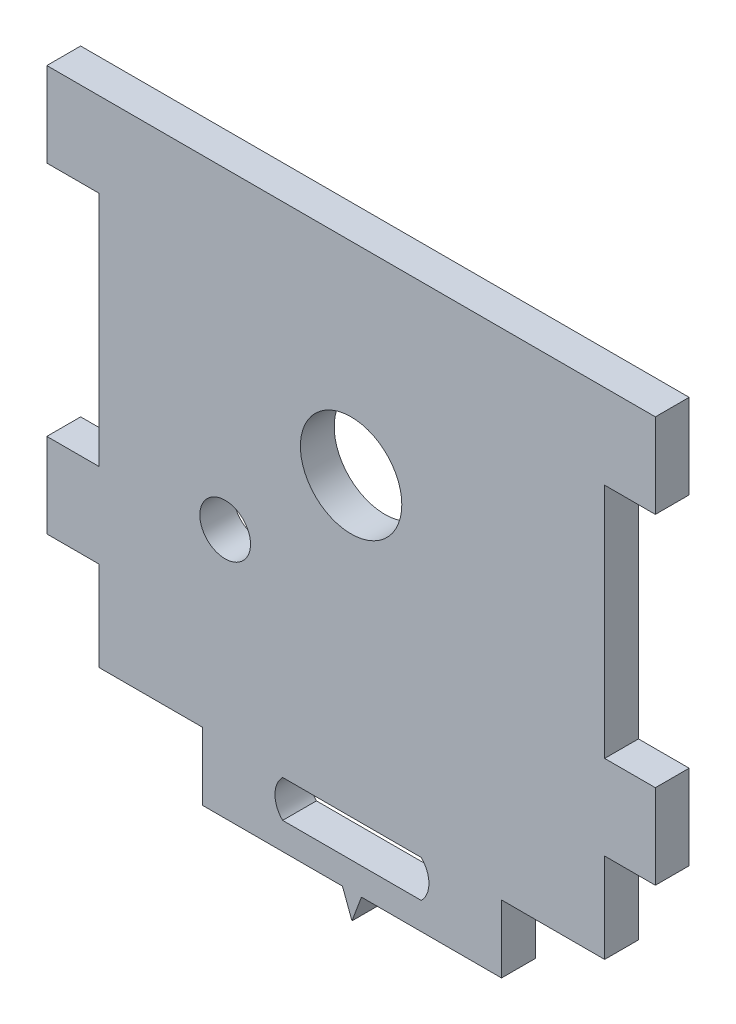
ISO-10303-21;
HEADER;
FILE_DESCRIPTION(('STEP AP214'),'2;1');
FILE_NAME('part.step','',(''),(''),'','','');
FILE_SCHEMA(('AUTOMOTIVE_DESIGN { 1 0 10303 214 1 1 1 1 }'));
ENDSEC;
DATA;
#1=APPLICATION_CONTEXT('core data for automotive mechanical design processes');
#2=APPLICATION_PROTOCOL_DEFINITION('international standard','automotive_design',2000,#1);
#3=PRODUCT_CONTEXT('',#1,'mechanical');
#4=PRODUCT('Part','Part','',(#3));
#5=PRODUCT_RELATED_PRODUCT_CATEGORY('part','',(#4));
#6=PRODUCT_DEFINITION_FORMATION('','',#4);
#7=PRODUCT_DEFINITION_CONTEXT('part definition',#1,'design');
#8=PRODUCT_DEFINITION('design','',#6,#7);
#9=PRODUCT_DEFINITION_SHAPE('','',#8);
#10=(LENGTH_UNIT() NAMED_UNIT(*) SI_UNIT(.MILLI.,.METRE.));
#11=(NAMED_UNIT(*) PLANE_ANGLE_UNIT() SI_UNIT($,.RADIAN.));
#12=(NAMED_UNIT(*) SI_UNIT($,.STERADIAN.) SOLID_ANGLE_UNIT());
#13=UNCERTAINTY_MEASURE_WITH_UNIT(LENGTH_MEASURE(1.E-05),#10,'distance_accuracy_value','');
#14=(GEOMETRIC_REPRESENTATION_CONTEXT(3) GLOBAL_UNCERTAINTY_ASSIGNED_CONTEXT((#13)) GLOBAL_UNIT_ASSIGNED_CONTEXT((#10,
#11,#12)) REPRESENTATION_CONTEXT('',''));
#15=CARTESIAN_POINT('',(0.,0.,0.));
#16=DIRECTION('',(0.,0.,1.));
#17=DIRECTION('',(1.,0.,0.));
#18=AXIS2_PLACEMENT_3D('',#15,#16,#17);
#19=CARTESIAN_POINT('',(0.,0.,2.));
#20=DIRECTION('',(0.,0.,1.));
#21=DIRECTION('',(1.,0.,0.));
#22=AXIS2_PLACEMENT_3D('',#19,#20,#21);
#23=PLANE('',#22);
#24=DIRECTION('',(-1.,0.,0.));
#25=VECTOR('',#24,1.);
#26=CARTESIAN_POINT('',(-22.05,-24.5,2.));
#27=LINE('',#26,#25);
#28=CARTESIAN_POINT('',(-13.85,-24.5,2.));
#29=VERTEX_POINT('',#28);
#30=CARTESIAN_POINT('',(-22.05,-24.5,2.));
#31=VERTEX_POINT('',#30);
#32=EDGE_CURVE('E220',#29,#31,#27,.T.);
#33=ORIENTED_EDGE('',*,*,#32,.F.);
#34=CARTESIAN_POINT('',(-14.95,-25.6,2.));
#35=DIRECTION('',(0.,0.,1.));
#36=DIRECTION('',(1.,0.,0.));
#37=AXIS2_PLACEMENT_3D('',#34,#35,#36);
#38=CIRCLE('',#37,1.55563491861041);
#39=CARTESIAN_POINT('',(-13.85,-26.7,2.));
#40=VERTEX_POINT('',#39);
#41=EDGE_CURVE('E212',#40,#29,#38,.T.);
#42=ORIENTED_EDGE('',*,*,#41,.F.);
#43=DIRECTION('',(1.,0.,0.));
#44=VECTOR('',#43,1.);
#45=CARTESIAN_POINT('',(-22.05,-26.7,2.));
#46=LINE('',#45,#44);
#47=CARTESIAN_POINT('',(-22.05,-26.7,2.));
#48=VERTEX_POINT('',#47);
#49=EDGE_CURVE('E235',#48,#40,#46,.T.);
#50=ORIENTED_EDGE('',*,*,#49,.F.);
#51=CARTESIAN_POINT('',(-20.95,-25.6,2.));
#52=DIRECTION('',(0.,0.,1.));
#53=DIRECTION('',(-1.,0.,0.));
#54=AXIS2_PLACEMENT_3D('',#51,#52,#53);
#55=CIRCLE('',#54,1.55563491861041);
#56=EDGE_CURVE('E233',#31,#48,#55,.T.);
#57=ORIENTED_EDGE('',*,*,#56,.F.);
#58=EDGE_LOOP('',(#33,#42,#50,#57));
#59=FACE_BOUND('',#58,.T.);
#60=CARTESIAN_POINT('',(-18.,-7.,2.));
#61=DIRECTION('',(0.,0.,1.));
#62=DIRECTION('',(1.,0.,0.));
#63=AXIS2_PLACEMENT_3D('',#60,#61,#62);
#64=CIRCLE('',#63,3.);
#65=CARTESIAN_POINT('',(-15.,-7.,2.));
#66=VERTEX_POINT('',#65);
#67=EDGE_CURVE('E251',#66,#66,#64,.T.);
#68=ORIENTED_EDGE('',*,*,#67,.F.);
#69=EDGE_LOOP('',(#68));
#70=FACE_BOUND('',#69,.T.);
#71=DIRECTION('',(1.,0.,0.));
#72=VECTOR('',#71,1.);
#73=CARTESIAN_POINT('',(0.,0.,2.));
#74=LINE('',#73,#72);
#75=CARTESIAN_POINT('',(-3.,0.,2.));
#76=VERTEX_POINT('',#75);
#77=CARTESIAN_POINT('',(0.,0.,2.));
#78=VERTEX_POINT('',#77);
#79=EDGE_CURVE('E257',#76,#78,#74,.T.);
#80=ORIENTED_EDGE('',*,*,#79,.T.);
#81=DIRECTION('',(0.,1.,0.));
#82=VECTOR('',#81,1.);
#83=CARTESIAN_POINT('',(0.,0.,2.));
#84=LINE('',#83,#82);
#85=CARTESIAN_POINT('',(0.,5.,2.));
#86=VERTEX_POINT('',#85);
#87=EDGE_CURVE('E260',#78,#86,#84,.T.);
#88=ORIENTED_EDGE('',*,*,#87,.T.);
#89=DIRECTION('',(-1.,0.,0.));
#90=VECTOR('',#89,1.);
#91=CARTESIAN_POINT('',(0.,5.,2.));
#92=LINE('',#91,#90);
#93=CARTESIAN_POINT('',(-36.,5.,2.));
#94=VERTEX_POINT('',#93);
#95=EDGE_CURVE('E263',#86,#94,#92,.T.);
#96=ORIENTED_EDGE('',*,*,#95,.T.);
#97=DIRECTION('',(0.,-1.,0.));
#98=VECTOR('',#97,1.);
#99=CARTESIAN_POINT('',(-36.,0.,2.));
#100=LINE('',#99,#98);
#101=CARTESIAN_POINT('',(-36.,0.,2.));
#102=VERTEX_POINT('',#101);
#103=EDGE_CURVE('E265',#94,#102,#100,.T.);
#104=ORIENTED_EDGE('',*,*,#103,.T.);
#105=DIRECTION('',(1.,0.,0.));
#106=VECTOR('',#105,1.);
#107=CARTESIAN_POINT('',(-36.,0.,2.));
#108=LINE('',#107,#106);
#109=CARTESIAN_POINT('',(-32.9,0.,2.));
#110=VERTEX_POINT('',#109);
#111=EDGE_CURVE('E267',#102,#110,#108,.T.);
#112=ORIENTED_EDGE('',*,*,#111,.T.);
#113=DIRECTION('',(0.,-1.,0.));
#114=VECTOR('',#113,1.);
#115=CARTESIAN_POINT('',(-32.9,0.,2.));
#116=LINE('',#115,#114);
#117=CARTESIAN_POINT('',(-32.9,-14.,2.));
#118=VERTEX_POINT('',#117);
#119=EDGE_CURVE('E269',#110,#118,#116,.T.);
#120=ORIENTED_EDGE('',*,*,#119,.T.);
#121=DIRECTION('',(-1.,0.,0.));
#122=VECTOR('',#121,1.);
#123=CARTESIAN_POINT('',(-32.9,-14.,2.));
#124=LINE('',#123,#122);
#125=CARTESIAN_POINT('',(-36.,-14.,2.));
#126=VERTEX_POINT('',#125);
#127=EDGE_CURVE('E271',#118,#126,#124,.T.);
#128=ORIENTED_EDGE('',*,*,#127,.T.);
#129=DIRECTION('',(0.,-1.,0.));
#130=VECTOR('',#129,1.);
#131=CARTESIAN_POINT('',(-36.,-14.,2.));
#132=LINE('',#131,#130);
#133=CARTESIAN_POINT('',(-36.,-19.,2.));
#134=VERTEX_POINT('',#133);
#135=EDGE_CURVE('E273',#126,#134,#132,.T.);
#136=ORIENTED_EDGE('',*,*,#135,.T.);
#137=DIRECTION('',(1.,0.,0.));
#138=VECTOR('',#137,1.);
#139=CARTESIAN_POINT('',(-36.,-19.,2.));
#140=LINE('',#139,#138);
#141=CARTESIAN_POINT('',(-32.9,-19.,2.));
#142=VERTEX_POINT('',#141);
#143=EDGE_CURVE('E275',#134,#142,#140,.T.);
#144=ORIENTED_EDGE('',*,*,#143,.T.);
#145=DIRECTION('',(0.,-1.,0.));
#146=VECTOR('',#145,1.);
#147=CARTESIAN_POINT('',(-32.9,-19.,2.));
#148=LINE('',#147,#146);
#149=CARTESIAN_POINT('',(-32.9,-24.3,2.));
#150=VERTEX_POINT('',#149);
#151=EDGE_CURVE('E277',#142,#150,#148,.T.);
#152=ORIENTED_EDGE('',*,*,#151,.T.);
#153=DIRECTION('',(1.,0.,0.));
#154=VECTOR('',#153,1.);
#155=CARTESIAN_POINT('',(-32.9,-24.3,2.));
#156=LINE('',#155,#154);
#157=CARTESIAN_POINT('',(-26.8,-24.3,2.));
#158=VERTEX_POINT('',#157);
#159=EDGE_CURVE('E279',#150,#158,#156,.T.);
#160=ORIENTED_EDGE('',*,*,#159,.T.);
#161=DIRECTION('',(0.,-1.,0.));
#162=VECTOR('',#161,1.);
#163=CARTESIAN_POINT('',(-26.8,-28.3,2.));
#164=LINE('',#163,#162);
#165=CARTESIAN_POINT('',(-26.8,-28.3,2.));
#166=VERTEX_POINT('',#165);
#167=EDGE_CURVE('E281',#158,#166,#164,.T.);
#168=ORIENTED_EDGE('',*,*,#167,.T.);
#169=DIRECTION('',(1.,0.,0.));
#170=VECTOR('',#169,1.);
#171=CARTESIAN_POINT('',(-18.511559339157,-28.3,2.));
#172=LINE('',#171,#170);
#173=CARTESIAN_POINT('',(-18.511559339157,-28.3,2.));
#174=VERTEX_POINT('',#173);
#175=EDGE_CURVE('E283',#166,#174,#172,.T.);
#176=ORIENTED_EDGE('',*,*,#175,.T.);
#177=DIRECTION('',(0.350608495530958,-0.936522120860751,0.));
#178=VECTOR('',#177,1.);
#179=CARTESIAN_POINT('',(-17.95,-29.8,2.));
#180=LINE('',#179,#178);
#181=CARTESIAN_POINT('',(-17.95,-29.8,2.));
#182=VERTEX_POINT('',#181);
#183=EDGE_CURVE('E285',#174,#182,#180,.T.);
#184=ORIENTED_EDGE('',*,*,#183,.T.);
#185=DIRECTION('',(0.350608495530958,0.936522120860751,0.));
#186=VECTOR('',#185,1.);
#187=CARTESIAN_POINT('',(-17.95,-29.8,2.));
#188=LINE('',#187,#186);
#189=CARTESIAN_POINT('',(-17.388440660843,-28.3,2.));
#190=VERTEX_POINT('',#189);
#191=EDGE_CURVE('E287',#182,#190,#188,.T.);
#192=ORIENTED_EDGE('',*,*,#191,.T.);
#193=DIRECTION('',(1.,0.,0.));
#194=VECTOR('',#193,1.);
#195=CARTESIAN_POINT('',(-17.388440660843,-28.3,2.));
#196=LINE('',#195,#194);
#197=CARTESIAN_POINT('',(-9.1,-28.3,2.));
#198=VERTEX_POINT('',#197);
#199=EDGE_CURVE('E289',#190,#198,#196,.T.);
#200=ORIENTED_EDGE('',*,*,#199,.T.);
#201=DIRECTION('',(0.,1.,0.));
#202=VECTOR('',#201,1.);
#203=CARTESIAN_POINT('',(-9.1,-24.3,2.));
#204=LINE('',#203,#202);
#205=CARTESIAN_POINT('',(-9.1,-24.3,2.));
#206=VERTEX_POINT('',#205);
#207=EDGE_CURVE('E291',#198,#206,#204,.T.);
#208=ORIENTED_EDGE('',*,*,#207,.T.);
#209=DIRECTION('',(1.,0.,0.));
#210=VECTOR('',#209,1.);
#211=CARTESIAN_POINT('',(-3.,-24.3,2.));
#212=LINE('',#211,#210);
#213=CARTESIAN_POINT('',(-3.,-24.3,2.));
#214=VERTEX_POINT('',#213);
#215=EDGE_CURVE('E293',#206,#214,#212,.T.);
#216=ORIENTED_EDGE('',*,*,#215,.T.);
#217=DIRECTION('',(0.,1.,0.));
#218=VECTOR('',#217,1.);
#219=CARTESIAN_POINT('',(-3.,-19.,2.));
#220=LINE('',#219,#218);
#221=CARTESIAN_POINT('',(-3.,-19.,2.));
#222=VERTEX_POINT('',#221);
#223=EDGE_CURVE('E295',#214,#222,#220,.T.);
#224=ORIENTED_EDGE('',*,*,#223,.T.);
#225=DIRECTION('',(1.,0.,0.));
#226=VECTOR('',#225,1.);
#227=CARTESIAN_POINT('',(0.,-19.,2.));
#228=LINE('',#227,#226);
#229=CARTESIAN_POINT('',(0.,-19.,2.));
#230=VERTEX_POINT('',#229);
#231=EDGE_CURVE('E297',#222,#230,#228,.T.);
#232=ORIENTED_EDGE('',*,*,#231,.T.);
#233=DIRECTION('',(0.,1.,0.));
#234=VECTOR('',#233,1.);
#235=CARTESIAN_POINT('',(0.,-14.,2.));
#236=LINE('',#235,#234);
#237=CARTESIAN_POINT('',(0.,-14.,2.));
#238=VERTEX_POINT('',#237);
#239=EDGE_CURVE('E299',#230,#238,#236,.T.);
#240=ORIENTED_EDGE('',*,*,#239,.T.);
#241=DIRECTION('',(-1.,0.,0.));
#242=VECTOR('',#241,1.);
#243=CARTESIAN_POINT('',(-3.,-14.,2.));
#244=LINE('',#243,#242);
#245=CARTESIAN_POINT('',(-3.,-14.,2.));
#246=VERTEX_POINT('',#245);
#247=EDGE_CURVE('E301',#238,#246,#244,.T.);
#248=ORIENTED_EDGE('',*,*,#247,.T.);
#249=DIRECTION('',(0.,1.,0.));
#250=VECTOR('',#249,1.);
#251=CARTESIAN_POINT('',(-3.,0.,2.));
#252=LINE('',#251,#250);
#253=EDGE_CURVE('E303',#246,#76,#252,.T.);
#254=ORIENTED_EDGE('',*,*,#253,.T.);
#255=EDGE_LOOP('',(#80,#88,#96,#104,#112,#120,#128,#136,#144,#152,#160,#168,#176,#184,#192,#200,
#208,#216,#224,#232,#240,#248,#254));
#256=FACE_BOUND('',#255,.T.);
#257=CARTESIAN_POINT('',(-25.45,-13.5,2.));
#258=DIRECTION('',(0.,0.,1.));
#259=DIRECTION('',(1.,0.,0.));
#260=AXIS2_PLACEMENT_3D('',#257,#258,#259);
#261=CIRCLE('',#260,1.5);
#262=CARTESIAN_POINT('',(-23.95,-13.5,2.));
#263=VERTEX_POINT('',#262);
#264=EDGE_CURVE('E241',#263,#263,#261,.T.);
#265=ORIENTED_EDGE('',*,*,#264,.F.);
#266=EDGE_LOOP('',(#265));
#267=FACE_BOUND('',#266,.T.);
#268=ADVANCED_FACE('F33',(#59,#70,#256,#267),#23,.T.);
#269=CARTESIAN_POINT('',(0.,0.,0.));
#270=DIRECTION('',(0.,0.,1.));
#271=DIRECTION('',(1.,0.,0.));
#272=AXIS2_PLACEMENT_3D('',#269,#270,#271);
#273=PLANE('',#272);
#274=CARTESIAN_POINT('',(-18.,-7.,0.));
#275=DIRECTION('',(0.,0.,1.));
#276=DIRECTION('',(1.,0.,0.));
#277=AXIS2_PLACEMENT_3D('',#274,#275,#276);
#278=CIRCLE('',#277,3.);
#279=CARTESIAN_POINT('',(-15.,-7.,0.));
#280=VERTEX_POINT('',#279);
#281=EDGE_CURVE('E228',#280,#280,#278,.T.);
#282=ORIENTED_EDGE('',*,*,#281,.T.);
#283=EDGE_LOOP('',(#282));
#284=FACE_BOUND('',#283,.T.);
#285=DIRECTION('',(1.,0.,0.));
#286=VECTOR('',#285,1.);
#287=CARTESIAN_POINT('',(0.,0.,0.));
#288=LINE('',#287,#286);
#289=CARTESIAN_POINT('',(-3.,0.,0.));
#290=VERTEX_POINT('',#289);
#291=CARTESIAN_POINT('',(0.,0.,0.));
#292=VERTEX_POINT('',#291);
#293=EDGE_CURVE('E254',#290,#292,#288,.T.);
#294=ORIENTED_EDGE('',*,*,#293,.F.);
#295=DIRECTION('',(0.,1.,0.));
#296=VECTOR('',#295,1.);
#297=CARTESIAN_POINT('',(-3.,0.,0.));
#298=LINE('',#297,#296);
#299=CARTESIAN_POINT('',(-3.,-14.,0.));
#300=VERTEX_POINT('',#299);
#301=EDGE_CURVE('E261',#300,#290,#298,.T.);
#302=ORIENTED_EDGE('',*,*,#301,.F.);
#303=DIRECTION('',(-1.,0.,0.));
#304=VECTOR('',#303,1.);
#305=CARTESIAN_POINT('',(-3.,-14.,0.));
#306=LINE('',#305,#304);
#307=CARTESIAN_POINT('',(0.,-14.,0.));
#308=VERTEX_POINT('',#307);
#309=EDGE_CURVE('E352',#308,#300,#306,.T.);
#310=ORIENTED_EDGE('',*,*,#309,.F.);
#311=DIRECTION('',(0.,1.,0.));
#312=VECTOR('',#311,1.);
#313=CARTESIAN_POINT('',(0.,-14.,0.));
#314=LINE('',#313,#312);
#315=CARTESIAN_POINT('',(0.,-19.,0.));
#316=VERTEX_POINT('',#315);
#317=EDGE_CURVE('E350',#316,#308,#314,.T.);
#318=ORIENTED_EDGE('',*,*,#317,.F.);
#319=DIRECTION('',(1.,0.,0.));
#320=VECTOR('',#319,1.);
#321=CARTESIAN_POINT('',(0.,-19.,0.));
#322=LINE('',#321,#320);
#323=CARTESIAN_POINT('',(-3.,-19.,0.));
#324=VERTEX_POINT('',#323);
#325=EDGE_CURVE('E348',#324,#316,#322,.T.);
#326=ORIENTED_EDGE('',*,*,#325,.F.);
#327=DIRECTION('',(0.,1.,0.));
#328=VECTOR('',#327,1.);
#329=CARTESIAN_POINT('',(-3.,-19.,0.));
#330=LINE('',#329,#328);
#331=CARTESIAN_POINT('',(-3.,-24.3,0.));
#332=VERTEX_POINT('',#331);
#333=EDGE_CURVE('E346',#332,#324,#330,.T.);
#334=ORIENTED_EDGE('',*,*,#333,.F.);
#335=DIRECTION('',(1.,0.,0.));
#336=VECTOR('',#335,1.);
#337=CARTESIAN_POINT('',(-3.,-24.3,0.));
#338=LINE('',#337,#336);
#339=CARTESIAN_POINT('',(-9.1,-24.3,0.));
#340=VERTEX_POINT('',#339);
#341=EDGE_CURVE('E344',#340,#332,#338,.T.);
#342=ORIENTED_EDGE('',*,*,#341,.F.);
#343=DIRECTION('',(0.,1.,0.));
#344=VECTOR('',#343,1.);
#345=CARTESIAN_POINT('',(-9.1,-24.3,0.));
#346=LINE('',#345,#344);
#347=CARTESIAN_POINT('',(-9.1,-28.3,0.));
#348=VERTEX_POINT('',#347);
#349=EDGE_CURVE('E342',#348,#340,#346,.T.);
#350=ORIENTED_EDGE('',*,*,#349,.F.);
#351=DIRECTION('',(1.,0.,0.));
#352=VECTOR('',#351,1.);
#353=CARTESIAN_POINT('',(-17.388440660843,-28.3,0.));
#354=LINE('',#353,#352);
#355=CARTESIAN_POINT('',(-17.388440660843,-28.3,0.));
#356=VERTEX_POINT('',#355);
#357=EDGE_CURVE('E340',#356,#348,#354,.T.);
#358=ORIENTED_EDGE('',*,*,#357,.F.);
#359=DIRECTION('',(0.350608495530958,0.936522120860751,0.));
#360=VECTOR('',#359,1.);
#361=CARTESIAN_POINT('',(-17.95,-29.8,0.));
#362=LINE('',#361,#360);
#363=CARTESIAN_POINT('',(-17.95,-29.8,0.));
#364=VERTEX_POINT('',#363);
#365=EDGE_CURVE('E338',#364,#356,#362,.T.);
#366=ORIENTED_EDGE('',*,*,#365,.F.);
#367=DIRECTION('',(0.350608495530958,-0.936522120860751,0.));
#368=VECTOR('',#367,1.);
#369=CARTESIAN_POINT('',(-17.95,-29.8,0.));
#370=LINE('',#369,#368);
#371=CARTESIAN_POINT('',(-18.511559339157,-28.3,0.));
#372=VERTEX_POINT('',#371);
#373=EDGE_CURVE('E336',#372,#364,#370,.T.);
#374=ORIENTED_EDGE('',*,*,#373,.F.);
#375=DIRECTION('',(1.,0.,0.));
#376=VECTOR('',#375,1.);
#377=CARTESIAN_POINT('',(-18.511559339157,-28.3,0.));
#378=LINE('',#377,#376);
#379=CARTESIAN_POINT('',(-26.8,-28.3,0.));
#380=VERTEX_POINT('',#379);
#381=EDGE_CURVE('E334',#380,#372,#378,.T.);
#382=ORIENTED_EDGE('',*,*,#381,.F.);
#383=DIRECTION('',(0.,-1.,0.));
#384=VECTOR('',#383,1.);
#385=CARTESIAN_POINT('',(-26.8,-28.3,0.));
#386=LINE('',#385,#384);
#387=CARTESIAN_POINT('',(-26.8,-24.3,0.));
#388=VERTEX_POINT('',#387);
#389=EDGE_CURVE('E332',#388,#380,#386,.T.);
#390=ORIENTED_EDGE('',*,*,#389,.F.);
#391=DIRECTION('',(1.,0.,0.));
#392=VECTOR('',#391,1.);
#393=CARTESIAN_POINT('',(-32.9,-24.3,0.));
#394=LINE('',#393,#392);
#395=CARTESIAN_POINT('',(-32.9,-24.3,0.));
#396=VERTEX_POINT('',#395);
#397=EDGE_CURVE('E330',#396,#388,#394,.T.);
#398=ORIENTED_EDGE('',*,*,#397,.F.);
#399=DIRECTION('',(0.,-1.,0.));
#400=VECTOR('',#399,1.);
#401=CARTESIAN_POINT('',(-32.9,-19.,0.));
#402=LINE('',#401,#400);
#403=CARTESIAN_POINT('',(-32.9,-19.,0.));
#404=VERTEX_POINT('',#403);
#405=EDGE_CURVE('E328',#404,#396,#402,.T.);
#406=ORIENTED_EDGE('',*,*,#405,.F.);
#407=DIRECTION('',(1.,0.,0.));
#408=VECTOR('',#407,1.);
#409=CARTESIAN_POINT('',(-33.,-19.,0.));
#410=LINE('',#409,#408);
#411=CARTESIAN_POINT('',(-36.,-19.,0.));
#412=VERTEX_POINT('',#411);
#413=EDGE_CURVE('E326',#412,#404,#410,.T.);
#414=ORIENTED_EDGE('',*,*,#413,.F.);
#415=DIRECTION('',(0.,-1.,0.));
#416=VECTOR('',#415,1.);
#417=CARTESIAN_POINT('',(-36.,-14.,0.));
#418=LINE('',#417,#416);
#419=CARTESIAN_POINT('',(-36.,-14.,0.));
#420=VERTEX_POINT('',#419);
#421=EDGE_CURVE('E323',#420,#412,#418,.T.);
#422=ORIENTED_EDGE('',*,*,#421,.F.);
#423=DIRECTION('',(-1.,0.,0.));
#424=VECTOR('',#423,1.);
#425=CARTESIAN_POINT('',(-33.,-14.,0.));
#426=LINE('',#425,#424);
#427=CARTESIAN_POINT('',(-32.9,-14.,0.));
#428=VERTEX_POINT('',#427);
#429=EDGE_CURVE('E321',#428,#420,#426,.T.);
#430=ORIENTED_EDGE('',*,*,#429,.F.);
#431=DIRECTION('',(0.,-1.,0.));
#432=VECTOR('',#431,1.);
#433=CARTESIAN_POINT('',(-32.9,0.,0.));
#434=LINE('',#433,#432);
#435=CARTESIAN_POINT('',(-32.9,0.,0.));
#436=VERTEX_POINT('',#435);
#437=EDGE_CURVE('E318',#436,#428,#434,.T.);
#438=ORIENTED_EDGE('',*,*,#437,.F.);
#439=DIRECTION('',(1.,0.,0.));
#440=VECTOR('',#439,1.);
#441=CARTESIAN_POINT('',(-33.,0.,0.));
#442=LINE('',#441,#440);
#443=CARTESIAN_POINT('',(-36.,0.,0.));
#444=VERTEX_POINT('',#443);
#445=EDGE_CURVE('E316',#444,#436,#442,.T.);
#446=ORIENTED_EDGE('',*,*,#445,.F.);
#447=DIRECTION('',(0.,-1.,0.));
#448=VECTOR('',#447,1.);
#449=CARTESIAN_POINT('',(-36.,0.,0.));
#450=LINE('',#449,#448);
#451=CARTESIAN_POINT('',(-36.,5.,0.));
#452=VERTEX_POINT('',#451);
#453=EDGE_CURVE('E313',#452,#444,#450,.T.);
#454=ORIENTED_EDGE('',*,*,#453,.F.);
#455=DIRECTION('',(-1.,0.,0.));
#456=VECTOR('',#455,1.);
#457=CARTESIAN_POINT('',(-36.,5.,0.));
#458=LINE('',#457,#456);
#459=CARTESIAN_POINT('',(0.,5.,0.));
#460=VERTEX_POINT('',#459);
#461=EDGE_CURVE('E311',#460,#452,#458,.T.);
#462=ORIENTED_EDGE('',*,*,#461,.F.);
#463=DIRECTION('',(0.,1.,0.));
#464=VECTOR('',#463,1.);
#465=CARTESIAN_POINT('',(0.,0.,0.));
#466=LINE('',#465,#464);
#467=EDGE_CURVE('E308',#292,#460,#466,.T.);
#468=ORIENTED_EDGE('',*,*,#467,.F.);
#469=EDGE_LOOP('',(#294,#302,#310,#318,#326,#334,#342,#350,#358,#366,#374,#382,#390,#398,#406,
#414,#422,#430,#438,#446,#454,#462,#468));
#470=FACE_BOUND('',#469,.T.);
#471=CARTESIAN_POINT('',(-14.95,-25.6,0.));
#472=DIRECTION('',(0.,0.,1.));
#473=DIRECTION('',(1.,0.,0.));
#474=AXIS2_PLACEMENT_3D('',#471,#472,#473);
#475=CIRCLE('',#474,1.55563491861041);
#476=CARTESIAN_POINT('',(-13.85,-26.7,0.));
#477=VERTEX_POINT('',#476);
#478=CARTESIAN_POINT('',(-13.85,-24.5,0.));
#479=VERTEX_POINT('',#478);
#480=EDGE_CURVE('E56',#477,#479,#475,.T.);
#481=ORIENTED_EDGE('',*,*,#480,.T.);
#482=DIRECTION('',(-1.,0.,0.));
#483=VECTOR('',#482,1.);
#484=CARTESIAN_POINT('',(-22.05,-24.5,0.));
#485=LINE('',#484,#483);
#486=CARTESIAN_POINT('',(-22.05,-24.5,0.));
#487=VERTEX_POINT('',#486);
#488=EDGE_CURVE('E227',#479,#487,#485,.T.);
#489=ORIENTED_EDGE('',*,*,#488,.T.);
#490=CARTESIAN_POINT('',(-20.95,-25.6,0.));
#491=DIRECTION('',(0.,0.,1.));
#492=DIRECTION('',(-1.,0.,0.));
#493=AXIS2_PLACEMENT_3D('',#490,#491,#492);
#494=CIRCLE('',#493,1.55563491861041);
#495=CARTESIAN_POINT('',(-22.05,-26.7,0.));
#496=VERTEX_POINT('',#495);
#497=EDGE_CURVE('E243',#487,#496,#494,.T.);
#498=ORIENTED_EDGE('',*,*,#497,.T.);
#499=DIRECTION('',(1.,0.,0.));
#500=VECTOR('',#499,1.);
#501=CARTESIAN_POINT('',(-22.05,-26.7,0.));
#502=LINE('',#501,#500);
#503=EDGE_CURVE('E221',#496,#477,#502,.T.);
#504=ORIENTED_EDGE('',*,*,#503,.T.);
#505=EDGE_LOOP('',(#481,#489,#498,#504));
#506=FACE_BOUND('',#505,.T.);
#507=CARTESIAN_POINT('',(-25.45,-13.5,0.));
#508=DIRECTION('',(0.,0.,1.));
#509=DIRECTION('',(1.,0.,0.));
#510=AXIS2_PLACEMENT_3D('',#507,#508,#509);
#511=CIRCLE('',#510,1.5);
#512=CARTESIAN_POINT('',(-23.95,-13.5,0.));
#513=VERTEX_POINT('',#512);
#514=EDGE_CURVE('E804',#513,#513,#511,.T.);
#515=ORIENTED_EDGE('',*,*,#514,.T.);
#516=EDGE_LOOP('',(#515));
#517=FACE_BOUND('',#516,.T.);
#518=ADVANCED_FACE('F427',(#284,#470,#506,#517),#273,.F.);
#519=CARTESIAN_POINT('',(0.,0.,2.));
#520=DIRECTION('',(0.,1.,0.));
#521=DIRECTION('',(0.,0.,1.));
#522=AXIS2_PLACEMENT_3D('',#519,#520,#521);
#523=PLANE('',#522);
#524=ORIENTED_EDGE('',*,*,#293,.T.);
#525=DIRECTION('',(0.,0.,-1.));
#526=VECTOR('',#525,1.);
#527=CARTESIAN_POINT('',(0.,0.,2.));
#528=LINE('',#527,#526);
#529=EDGE_CURVE('E11',#78,#292,#528,.T.);
#530=ORIENTED_EDGE('',*,*,#529,.F.);
#531=ORIENTED_EDGE('',*,*,#79,.F.);
#532=DIRECTION('',(0.,0.,-1.));
#533=VECTOR('',#532,1.);
#534=CARTESIAN_POINT('',(-3.,0.,2.));
#535=LINE('',#534,#533);
#536=EDGE_CURVE('E305',#76,#290,#535,.T.);
#537=ORIENTED_EDGE('',*,*,#536,.T.);
#538=EDGE_LOOP('',(#524,#530,#531,#537));
#539=FACE_BOUND('',#538,.T.);
#540=ADVANCED_FACE('F35',(#539),#523,.F.);
#541=CARTESIAN_POINT('',(0.,0.,2.));
#542=DIRECTION('',(-1.,0.,0.));
#543=DIRECTION('',(0.,0.,1.));
#544=AXIS2_PLACEMENT_3D('',#541,#542,#543);
#545=PLANE('',#544);
#546=ORIENTED_EDGE('',*,*,#467,.T.);
#547=DIRECTION('',(0.,0.,-1.));
#548=VECTOR('',#547,1.);
#549=CARTESIAN_POINT('',(0.,5.,2.));
#550=LINE('',#549,#548);
#551=EDGE_CURVE('E41',#86,#460,#550,.T.);
#552=ORIENTED_EDGE('',*,*,#551,.F.);
#553=ORIENTED_EDGE('',*,*,#87,.F.);
#554=ORIENTED_EDGE('',*,*,#529,.T.);
#555=EDGE_LOOP('',(#546,#552,#553,#554));
#556=FACE_BOUND('',#555,.T.);
#557=ADVANCED_FACE('F423',(#556),#545,.F.);
#558=CARTESIAN_POINT('',(-36.,5.,2.));
#559=DIRECTION('',(0.,-1.,0.));
#560=DIRECTION('',(0.,0.,-1.));
#561=AXIS2_PLACEMENT_3D('',#558,#559,#560);
#562=PLANE('',#561);
#563=ORIENTED_EDGE('',*,*,#461,.T.);
#564=DIRECTION('',(0.,0.,-1.));
#565=VECTOR('',#564,1.);
#566=CARTESIAN_POINT('',(-36.,5.,2.));
#567=LINE('',#566,#565);
#568=EDGE_CURVE('E414',#94,#452,#567,.T.);
#569=ORIENTED_EDGE('',*,*,#568,.F.);
#570=ORIENTED_EDGE('',*,*,#95,.F.);
#571=ORIENTED_EDGE('',*,*,#551,.T.);
#572=EDGE_LOOP('',(#563,#569,#570,#571));
#573=FACE_BOUND('',#572,.T.);
#574=ADVANCED_FACE('F420',(#573),#562,.F.);
#575=CARTESIAN_POINT('',(-36.,0.,2.));
#576=DIRECTION('',(1.,0.,0.));
#577=DIRECTION('',(0.,0.,-1.));
#578=AXIS2_PLACEMENT_3D('',#575,#576,#577);
#579=PLANE('',#578);
#580=ORIENTED_EDGE('',*,*,#453,.T.);
#581=DIRECTION('',(0.,0.,-1.));
#582=VECTOR('',#581,1.);
#583=CARTESIAN_POINT('',(-36.,0.,2.));
#584=LINE('',#583,#582);
#585=EDGE_CURVE('E411',#102,#444,#584,.T.);
#586=ORIENTED_EDGE('',*,*,#585,.F.);
#587=ORIENTED_EDGE('',*,*,#103,.F.);
#588=ORIENTED_EDGE('',*,*,#568,.T.);
#589=EDGE_LOOP('',(#580,#586,#587,#588));
#590=FACE_BOUND('',#589,.T.);
#591=ADVANCED_FACE('F434',(#590),#579,.F.);
#592=CARTESIAN_POINT('',(-33.,0.,2.));
#593=DIRECTION('',(0.,1.,0.));
#594=DIRECTION('',(0.,0.,1.));
#595=AXIS2_PLACEMENT_3D('',#592,#593,#594);
#596=PLANE('',#595);
#597=ORIENTED_EDGE('',*,*,#445,.T.);
#598=DIRECTION('',(0.,0.,-1.));
#599=VECTOR('',#598,1.);
#600=CARTESIAN_POINT('',(-32.9,0.,2.));
#601=LINE('',#600,#599);
#602=EDGE_CURVE('E408',#110,#436,#601,.T.);
#603=ORIENTED_EDGE('',*,*,#602,.F.);
#604=ORIENTED_EDGE('',*,*,#111,.F.);
#605=ORIENTED_EDGE('',*,*,#585,.T.);
#606=EDGE_LOOP('',(#597,#603,#604,#605));
#607=FACE_BOUND('',#606,.T.);
#608=ADVANCED_FACE('F438',(#607),#596,.F.);
#609=CARTESIAN_POINT('',(-32.9,0.,2.));
#610=DIRECTION('',(1.,0.,0.));
#611=DIRECTION('',(0.,0.,-1.));
#612=AXIS2_PLACEMENT_3D('',#609,#610,#611);
#613=PLANE('',#612);
#614=ORIENTED_EDGE('',*,*,#437,.T.);
#615=DIRECTION('',(0.,0.,-1.));
#616=VECTOR('',#615,1.);
#617=CARTESIAN_POINT('',(-32.9,-14.,2.));
#618=LINE('',#617,#616);
#619=EDGE_CURVE('E405',#118,#428,#618,.T.);
#620=ORIENTED_EDGE('',*,*,#619,.F.);
#621=ORIENTED_EDGE('',*,*,#119,.F.);
#622=ORIENTED_EDGE('',*,*,#602,.T.);
#623=EDGE_LOOP('',(#614,#620,#621,#622));
#624=FACE_BOUND('',#623,.T.);
#625=ADVANCED_FACE('F527',(#624),#613,.F.);
#626=CARTESIAN_POINT('',(-33.,-14.,2.));
#627=DIRECTION('',(0.,-1.,0.));
#628=DIRECTION('',(0.,0.,-1.));
#629=AXIS2_PLACEMENT_3D('',#626,#627,#628);
#630=PLANE('',#629);
#631=ORIENTED_EDGE('',*,*,#429,.T.);
#632=DIRECTION('',(0.,0.,-1.));
#633=VECTOR('',#632,1.);
#634=CARTESIAN_POINT('',(-36.,-14.,2.));
#635=LINE('',#634,#633);
#636=EDGE_CURVE('E402',#126,#420,#635,.T.);
#637=ORIENTED_EDGE('',*,*,#636,.F.);
#638=ORIENTED_EDGE('',*,*,#127,.F.);
#639=ORIENTED_EDGE('',*,*,#619,.T.);
#640=EDGE_LOOP('',(#631,#637,#638,#639));
#641=FACE_BOUND('',#640,.T.);
#642=ADVANCED_FACE('F529',(#641),#630,.F.);
#643=CARTESIAN_POINT('',(-36.,-14.,2.));
#644=DIRECTION('',(1.,0.,0.));
#645=DIRECTION('',(0.,0.,-1.));
#646=AXIS2_PLACEMENT_3D('',#643,#644,#645);
#647=PLANE('',#646);
#648=ORIENTED_EDGE('',*,*,#421,.T.);
#649=DIRECTION('',(0.,0.,-1.));
#650=VECTOR('',#649,1.);
#651=CARTESIAN_POINT('',(-36.,-19.,2.));
#652=LINE('',#651,#650);
#653=EDGE_CURVE('E399',#134,#412,#652,.T.);
#654=ORIENTED_EDGE('',*,*,#653,.F.);
#655=ORIENTED_EDGE('',*,*,#135,.F.);
#656=ORIENTED_EDGE('',*,*,#636,.T.);
#657=EDGE_LOOP('',(#648,#654,#655,#656));
#658=FACE_BOUND('',#657,.T.);
#659=ADVANCED_FACE('F523',(#658),#647,.F.);
#660=CARTESIAN_POINT('',(-33.,-19.,2.));
#661=DIRECTION('',(0.,1.,0.));
#662=DIRECTION('',(0.,0.,1.));
#663=AXIS2_PLACEMENT_3D('',#660,#661,#662);
#664=PLANE('',#663);
#665=ORIENTED_EDGE('',*,*,#413,.T.);
#666=DIRECTION('',(0.,0.,-1.));
#667=VECTOR('',#666,1.);
#668=CARTESIAN_POINT('',(-32.9,-19.,2.));
#669=LINE('',#668,#667);
#670=EDGE_CURVE('E396',#142,#404,#669,.T.);
#671=ORIENTED_EDGE('',*,*,#670,.F.);
#672=ORIENTED_EDGE('',*,*,#143,.F.);
#673=ORIENTED_EDGE('',*,*,#653,.T.);
#674=EDGE_LOOP('',(#665,#671,#672,#673));
#675=FACE_BOUND('',#674,.T.);
#676=ADVANCED_FACE('F519',(#675),#664,.F.);
#677=CARTESIAN_POINT('',(-32.9,-19.,2.));
#678=DIRECTION('',(1.,0.,0.));
#679=DIRECTION('',(0.,1.,0.));
#680=AXIS2_PLACEMENT_3D('',#677,#678,#679);
#681=PLANE('',#680);
#682=ORIENTED_EDGE('',*,*,#405,.T.);
#683=DIRECTION('',(0.,0.,-1.));
#684=VECTOR('',#683,1.);
#685=CARTESIAN_POINT('',(-32.9,-24.3,2.));
#686=LINE('',#685,#684);
#687=EDGE_CURVE('E393',#150,#396,#686,.T.);
#688=ORIENTED_EDGE('',*,*,#687,.F.);
#689=ORIENTED_EDGE('',*,*,#151,.F.);
#690=ORIENTED_EDGE('',*,*,#670,.T.);
#691=EDGE_LOOP('',(#682,#688,#689,#690));
#692=FACE_BOUND('',#691,.T.);
#693=ADVANCED_FACE('F514',(#692),#681,.F.);
#694=CARTESIAN_POINT('',(-32.9,-24.3,2.));
#695=DIRECTION('',(0.,1.,0.));
#696=DIRECTION('',(0.,0.,1.));
#697=AXIS2_PLACEMENT_3D('',#694,#695,#696);
#698=PLANE('',#697);
#699=ORIENTED_EDGE('',*,*,#397,.T.);
#700=DIRECTION('',(0.,0.,-1.));
#701=VECTOR('',#700,1.);
#702=CARTESIAN_POINT('',(-26.8,-24.3,2.));
#703=LINE('',#702,#701);
#704=EDGE_CURVE('E390',#158,#388,#703,.T.);
#705=ORIENTED_EDGE('',*,*,#704,.F.);
#706=ORIENTED_EDGE('',*,*,#159,.F.);
#707=ORIENTED_EDGE('',*,*,#687,.T.);
#708=EDGE_LOOP('',(#699,#705,#706,#707));
#709=FACE_BOUND('',#708,.T.);
#710=ADVANCED_FACE('F509',(#709),#698,.F.);
#711=CARTESIAN_POINT('',(-26.8,-28.3,2.));
#712=DIRECTION('',(1.,0.,0.));
#713=DIRECTION('',(0.,0.,-1.));
#714=AXIS2_PLACEMENT_3D('',#711,#712,#713);
#715=PLANE('',#714);
#716=ORIENTED_EDGE('',*,*,#389,.T.);
#717=DIRECTION('',(0.,0.,-1.));
#718=VECTOR('',#717,1.);
#719=CARTESIAN_POINT('',(-26.8,-28.3,2.));
#720=LINE('',#719,#718);
#721=EDGE_CURVE('E387',#166,#380,#720,.T.);
#722=ORIENTED_EDGE('',*,*,#721,.F.);
#723=ORIENTED_EDGE('',*,*,#167,.F.);
#724=ORIENTED_EDGE('',*,*,#704,.T.);
#725=EDGE_LOOP('',(#716,#722,#723,#724));
#726=FACE_BOUND('',#725,.T.);
#727=ADVANCED_FACE('F505',(#726),#715,.F.);
#728=CARTESIAN_POINT('',(-18.511559339157,-28.3,2.));
#729=DIRECTION('',(0.,1.,0.));
#730=DIRECTION('',(0.,0.,1.));
#731=AXIS2_PLACEMENT_3D('',#728,#729,#730);
#732=PLANE('',#731);
#733=ORIENTED_EDGE('',*,*,#381,.T.);
#734=DIRECTION('',(0.,0.,-1.));
#735=VECTOR('',#734,1.);
#736=CARTESIAN_POINT('',(-18.511559339157,-28.3,2.));
#737=LINE('',#736,#735);
#738=EDGE_CURVE('E384',#174,#372,#737,.T.);
#739=ORIENTED_EDGE('',*,*,#738,.F.);
#740=ORIENTED_EDGE('',*,*,#175,.F.);
#741=ORIENTED_EDGE('',*,*,#721,.T.);
#742=EDGE_LOOP('',(#733,#739,#740,#741));
#743=FACE_BOUND('',#742,.T.);
#744=ADVANCED_FACE('F500',(#743),#732,.F.);
#745=CARTESIAN_POINT('',(-17.95,-29.8,2.));
#746=DIRECTION('',(0.936522120860751,0.350608495530958,0.));
#747=DIRECTION('',(-0.350608495530958,0.936522120860751,0.));
#748=AXIS2_PLACEMENT_3D('',#745,#746,#747);
#749=PLANE('',#748);
#750=ORIENTED_EDGE('',*,*,#373,.T.);
#751=DIRECTION('',(0.,0.,-1.));
#752=VECTOR('',#751,1.);
#753=CARTESIAN_POINT('',(-17.95,-29.8,2.));
#754=LINE('',#753,#752);
#755=EDGE_CURVE('E381',#182,#364,#754,.T.);
#756=ORIENTED_EDGE('',*,*,#755,.F.);
#757=ORIENTED_EDGE('',*,*,#183,.F.);
#758=ORIENTED_EDGE('',*,*,#738,.T.);
#759=EDGE_LOOP('',(#750,#756,#757,#758));
#760=FACE_BOUND('',#759,.T.);
#761=ADVANCED_FACE('F494',(#760),#749,.F.);
#762=CARTESIAN_POINT('',(-17.95,-29.8,2.));
#763=DIRECTION('',(-0.936522120860751,0.350608495530958,0.));
#764=DIRECTION('',(-0.350608495530958,-0.936522120860751,0.));
#765=AXIS2_PLACEMENT_3D('',#762,#763,#764);
#766=PLANE('',#765);
#767=ORIENTED_EDGE('',*,*,#365,.T.);
#768=DIRECTION('',(0.,0.,-1.));
#769=VECTOR('',#768,1.);
#770=CARTESIAN_POINT('',(-17.388440660843,-28.3,2.));
#771=LINE('',#770,#769);
#772=EDGE_CURVE('E378',#190,#356,#771,.T.);
#773=ORIENTED_EDGE('',*,*,#772,.F.);
#774=ORIENTED_EDGE('',*,*,#191,.F.);
#775=ORIENTED_EDGE('',*,*,#755,.T.);
#776=EDGE_LOOP('',(#767,#773,#774,#775));
#777=FACE_BOUND('',#776,.T.);
#778=ADVANCED_FACE('F490',(#777),#766,.F.);
#779=CARTESIAN_POINT('',(-17.388440660843,-28.3,2.));
#780=DIRECTION('',(0.,1.,0.));
#781=DIRECTION('',(0.,0.,1.));
#782=AXIS2_PLACEMENT_3D('',#779,#780,#781);
#783=PLANE('',#782);
#784=ORIENTED_EDGE('',*,*,#357,.T.);
#785=DIRECTION('',(0.,0.,-1.));
#786=VECTOR('',#785,1.);
#787=CARTESIAN_POINT('',(-9.1,-28.3,2.));
#788=LINE('',#787,#786);
#789=EDGE_CURVE('E375',#198,#348,#788,.T.);
#790=ORIENTED_EDGE('',*,*,#789,.F.);
#791=ORIENTED_EDGE('',*,*,#199,.F.);
#792=ORIENTED_EDGE('',*,*,#772,.T.);
#793=EDGE_LOOP('',(#784,#790,#791,#792));
#794=FACE_BOUND('',#793,.T.);
#795=ADVANCED_FACE('F485',(#794),#783,.F.);
#796=CARTESIAN_POINT('',(-9.1,-24.3,2.));
#797=DIRECTION('',(-1.,0.,0.));
#798=DIRECTION('',(0.,-1.,0.));
#799=AXIS2_PLACEMENT_3D('',#796,#797,#798);
#800=PLANE('',#799);
#801=ORIENTED_EDGE('',*,*,#349,.T.);
#802=DIRECTION('',(0.,0.,-1.));
#803=VECTOR('',#802,1.);
#804=CARTESIAN_POINT('',(-9.1,-24.3,2.));
#805=LINE('',#804,#803);
#806=EDGE_CURVE('E372',#206,#340,#805,.T.);
#807=ORIENTED_EDGE('',*,*,#806,.F.);
#808=ORIENTED_EDGE('',*,*,#207,.F.);
#809=ORIENTED_EDGE('',*,*,#789,.T.);
#810=EDGE_LOOP('',(#801,#807,#808,#809));
#811=FACE_BOUND('',#810,.T.);
#812=ADVANCED_FACE('F479',(#811),#800,.F.);
#813=CARTESIAN_POINT('',(-3.,-24.3,2.));
#814=DIRECTION('',(0.,1.,0.));
#815=DIRECTION('',(0.,0.,1.));
#816=AXIS2_PLACEMENT_3D('',#813,#814,#815);
#817=PLANE('',#816);
#818=ORIENTED_EDGE('',*,*,#341,.T.);
#819=DIRECTION('',(0.,0.,-1.));
#820=VECTOR('',#819,1.);
#821=CARTESIAN_POINT('',(-3.,-24.3,2.));
#822=LINE('',#821,#820);
#823=EDGE_CURVE('E369',#214,#332,#822,.T.);
#824=ORIENTED_EDGE('',*,*,#823,.F.);
#825=ORIENTED_EDGE('',*,*,#215,.F.);
#826=ORIENTED_EDGE('',*,*,#806,.T.);
#827=EDGE_LOOP('',(#818,#824,#825,#826));
#828=FACE_BOUND('',#827,.T.);
#829=ADVANCED_FACE('F475',(#828),#817,.F.);
#830=CARTESIAN_POINT('',(-3.,-19.,2.));
#831=DIRECTION('',(-1.,0.,0.));
#832=DIRECTION('',(0.,0.,1.));
#833=AXIS2_PLACEMENT_3D('',#830,#831,#832);
#834=PLANE('',#833);
#835=ORIENTED_EDGE('',*,*,#333,.T.);
#836=DIRECTION('',(0.,0.,-1.));
#837=VECTOR('',#836,1.);
#838=CARTESIAN_POINT('',(-3.,-19.,2.));
#839=LINE('',#838,#837);
#840=EDGE_CURVE('E366',#222,#324,#839,.T.);
#841=ORIENTED_EDGE('',*,*,#840,.F.);
#842=ORIENTED_EDGE('',*,*,#223,.F.);
#843=ORIENTED_EDGE('',*,*,#823,.T.);
#844=EDGE_LOOP('',(#835,#841,#842,#843));
#845=FACE_BOUND('',#844,.T.);
#846=ADVANCED_FACE('F470',(#845),#834,.F.);
#847=CARTESIAN_POINT('',(0.,-19.,2.));
#848=DIRECTION('',(0.,1.,0.));
#849=DIRECTION('',(0.,0.,1.));
#850=AXIS2_PLACEMENT_3D('',#847,#848,#849);
#851=PLANE('',#850);
#852=ORIENTED_EDGE('',*,*,#325,.T.);
#853=DIRECTION('',(0.,0.,-1.));
#854=VECTOR('',#853,1.);
#855=CARTESIAN_POINT('',(0.,-19.,2.));
#856=LINE('',#855,#854);
#857=EDGE_CURVE('E363',#230,#316,#856,.T.);
#858=ORIENTED_EDGE('',*,*,#857,.F.);
#859=ORIENTED_EDGE('',*,*,#231,.F.);
#860=ORIENTED_EDGE('',*,*,#840,.T.);
#861=EDGE_LOOP('',(#852,#858,#859,#860));
#862=FACE_BOUND('',#861,.T.);
#863=ADVANCED_FACE('F464',(#862),#851,.F.);
#864=CARTESIAN_POINT('',(0.,-14.,2.));
#865=DIRECTION('',(-1.,0.,0.));
#866=DIRECTION('',(0.,-1.,0.));
#867=AXIS2_PLACEMENT_3D('',#864,#865,#866);
#868=PLANE('',#867);
#869=ORIENTED_EDGE('',*,*,#317,.T.);
#870=DIRECTION('',(0.,0.,-1.));
#871=VECTOR('',#870,1.);
#872=CARTESIAN_POINT('',(0.,-14.,2.));
#873=LINE('',#872,#871);
#874=EDGE_CURVE('E360',#238,#308,#873,.T.);
#875=ORIENTED_EDGE('',*,*,#874,.F.);
#876=ORIENTED_EDGE('',*,*,#239,.F.);
#877=ORIENTED_EDGE('',*,*,#857,.T.);
#878=EDGE_LOOP('',(#869,#875,#876,#877));
#879=FACE_BOUND('',#878,.T.);
#880=ADVANCED_FACE('F460',(#879),#868,.F.);
#881=CARTESIAN_POINT('',(-3.,-14.,2.));
#882=DIRECTION('',(0.,-1.,0.));
#883=DIRECTION('',(0.,0.,-1.));
#884=AXIS2_PLACEMENT_3D('',#881,#882,#883);
#885=PLANE('',#884);
#886=ORIENTED_EDGE('',*,*,#309,.T.);
#887=DIRECTION('',(0.,0.,-1.));
#888=VECTOR('',#887,1.);
#889=CARTESIAN_POINT('',(-3.,-14.,2.));
#890=LINE('',#889,#888);
#891=EDGE_CURVE('E357',#246,#300,#890,.T.);
#892=ORIENTED_EDGE('',*,*,#891,.F.);
#893=ORIENTED_EDGE('',*,*,#247,.F.);
#894=ORIENTED_EDGE('',*,*,#874,.T.);
#895=EDGE_LOOP('',(#886,#892,#893,#894));
#896=FACE_BOUND('',#895,.T.);
#897=ADVANCED_FACE('F455',(#896),#885,.F.);
#898=CARTESIAN_POINT('',(-3.,0.,2.));
#899=DIRECTION('',(-1.,0.,0.));
#900=DIRECTION('',(0.,-1.,0.));
#901=AXIS2_PLACEMENT_3D('',#898,#899,#900);
#902=PLANE('',#901);
#903=ORIENTED_EDGE('',*,*,#301,.T.);
#904=ORIENTED_EDGE('',*,*,#536,.F.);
#905=ORIENTED_EDGE('',*,*,#253,.F.);
#906=ORIENTED_EDGE('',*,*,#891,.T.);
#907=EDGE_LOOP('',(#903,#904,#905,#906));
#908=FACE_BOUND('',#907,.T.);
#909=ADVANCED_FACE('F449',(#908),#902,.F.);
#910=CARTESIAN_POINT('',(-18.,-7.,2.));
#911=DIRECTION('',(0.,0.,-1.));
#912=DIRECTION('',(-1.,0.,0.));
#913=AXIS2_PLACEMENT_3D('',#910,#911,#912);
#914=CYLINDRICAL_SURFACE('',#913,3.);
#915=ORIENTED_EDGE('',*,*,#67,.T.);
#916=EDGE_LOOP('',(#915));
#917=FACE_BOUND('',#916,.T.);
#918=ORIENTED_EDGE('',*,*,#281,.F.);
#919=EDGE_LOOP('',(#918));
#920=FACE_BOUND('',#919,.T.);
#921=ADVANCED_FACE('F546',(#917,#920),#914,.F.);
#922=CARTESIAN_POINT('',(-14.95,-25.6,2.));
#923=DIRECTION('',(0.,0.,-1.));
#924=DIRECTION('',(-1.,0.,0.));
#925=AXIS2_PLACEMENT_3D('',#922,#923,#924);
#926=CYLINDRICAL_SURFACE('',#925,1.55563491861041);
#927=ORIENTED_EDGE('',*,*,#480,.F.);
#928=DIRECTION('',(0.,0.,-1.));
#929=VECTOR('',#928,1.);
#930=CARTESIAN_POINT('',(-13.85,-26.7,2.));
#931=LINE('',#930,#929);
#932=EDGE_CURVE('E216',#40,#477,#931,.T.);
#933=ORIENTED_EDGE('',*,*,#932,.F.);
#934=ORIENTED_EDGE('',*,*,#41,.T.);
#935=DIRECTION('',(0.,0.,-1.));
#936=VECTOR('',#935,1.);
#937=CARTESIAN_POINT('',(-13.85,-24.5,2.));
#938=LINE('',#937,#936);
#939=EDGE_CURVE('E215',#29,#479,#938,.T.);
#940=ORIENTED_EDGE('',*,*,#939,.T.);
#941=EDGE_LOOP('',(#927,#933,#934,#940));
#942=FACE_BOUND('',#941,.T.);
#943=ADVANCED_FACE('F214',(#942),#926,.F.);
#944=CARTESIAN_POINT('',(-22.05,-24.5,2.));
#945=DIRECTION('',(0.,-1.,0.));
#946=DIRECTION('',(0.,0.,-1.));
#947=AXIS2_PLACEMENT_3D('',#944,#945,#946);
#948=PLANE('',#947);
#949=ORIENTED_EDGE('',*,*,#488,.F.);
#950=ORIENTED_EDGE('',*,*,#939,.F.);
#951=ORIENTED_EDGE('',*,*,#32,.T.);
#952=DIRECTION('',(0.,0.,-1.));
#953=VECTOR('',#952,1.);
#954=CARTESIAN_POINT('',(-22.05,-24.5,2.));
#955=LINE('',#954,#953);
#956=EDGE_CURVE('E229',#31,#487,#955,.T.);
#957=ORIENTED_EDGE('',*,*,#956,.T.);
#958=EDGE_LOOP('',(#949,#950,#951,#957));
#959=FACE_BOUND('',#958,.T.);
#960=ADVANCED_FACE('F224',(#959),#948,.T.);
#961=CARTESIAN_POINT('',(-20.95,-25.6,2.));
#962=DIRECTION('',(0.,0.,-1.));
#963=DIRECTION('',(-1.,0.,0.));
#964=AXIS2_PLACEMENT_3D('',#961,#962,#963);
#965=CYLINDRICAL_SURFACE('',#964,1.55563491861041);
#966=ORIENTED_EDGE('',*,*,#497,.F.);
#967=ORIENTED_EDGE('',*,*,#956,.F.);
#968=ORIENTED_EDGE('',*,*,#56,.T.);
#969=DIRECTION('',(0.,0.,-1.));
#970=VECTOR('',#969,1.);
#971=CARTESIAN_POINT('',(-22.05,-26.7,2.));
#972=LINE('',#971,#970);
#973=EDGE_CURVE('E48',#48,#496,#972,.T.);
#974=ORIENTED_EDGE('',*,*,#973,.T.);
#975=EDGE_LOOP('',(#966,#967,#968,#974));
#976=FACE_BOUND('',#975,.T.);
#977=ADVANCED_FACE('F655',(#976),#965,.F.);
#978=CARTESIAN_POINT('',(-22.05,-26.7,2.));
#979=DIRECTION('',(0.,1.,0.));
#980=DIRECTION('',(0.,0.,1.));
#981=AXIS2_PLACEMENT_3D('',#978,#979,#980);
#982=PLANE('',#981);
#983=ORIENTED_EDGE('',*,*,#503,.F.);
#984=ORIENTED_EDGE('',*,*,#973,.F.);
#985=ORIENTED_EDGE('',*,*,#49,.T.);
#986=ORIENTED_EDGE('',*,*,#932,.T.);
#987=EDGE_LOOP('',(#983,#984,#985,#986));
#988=FACE_BOUND('',#987,.T.);
#989=ADVANCED_FACE('F662',(#988),#982,.T.);
#990=CARTESIAN_POINT('',(-25.45,-13.5,2.));
#991=DIRECTION('',(0.,0.,-1.));
#992=DIRECTION('',(-1.,0.,0.));
#993=AXIS2_PLACEMENT_3D('',#990,#991,#992);
#994=CYLINDRICAL_SURFACE('',#993,1.5);
#995=ORIENTED_EDGE('',*,*,#264,.T.);
#996=EDGE_LOOP('',(#995));
#997=FACE_BOUND('',#996,.T.);
#998=ORIENTED_EDGE('',*,*,#514,.F.);
#999=EDGE_LOOP('',(#998));
#1000=FACE_BOUND('',#999,.T.);
#1001=ADVANCED_FACE('F670',(#997,#1000),#994,.F.);
#1002=CLOSED_SHELL('',(#268,#518,#540,#557,#574,#591,#608,#625,#642,#659,#676,#693,#710,#727,
#744,#761,#778,#795,#812,#829,#846,#863,#880,#897,#909,#921,#943,#960,#977,#989,#1001));
#1003=MANIFOLD_SOLID_BREP('B2',#1002);
#1004=ADVANCED_BREP_SHAPE_REPRESENTATION('',(#18,#1003),#14);
#1005=SHAPE_DEFINITION_REPRESENTATION(#9,#1004);
ENDSEC;
END-ISO-10303-21;
